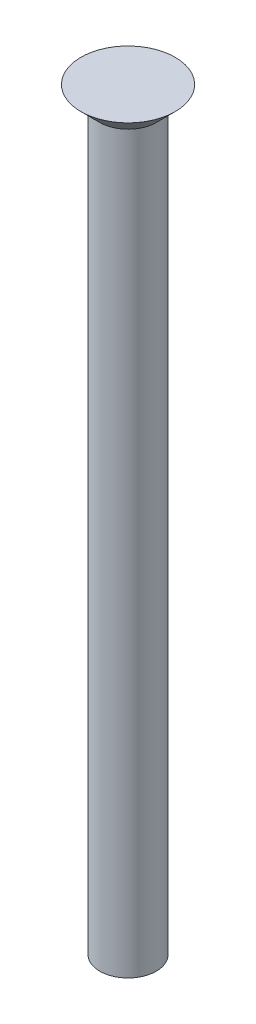
ISO-10303-21;
HEADER;
FILE_DESCRIPTION(('STEP AP214'),'2;1');
FILE_NAME('part.step','',(''),(''),'','','');
FILE_SCHEMA(('AUTOMOTIVE_DESIGN { 1 0 10303 214 1 1 1 1 }'));
ENDSEC;
DATA;
#1=APPLICATION_CONTEXT('core data for automotive mechanical design processes');
#2=APPLICATION_PROTOCOL_DEFINITION('international standard','automotive_design',2000,#1);
#3=PRODUCT_CONTEXT('',#1,'mechanical');
#4=PRODUCT('Part','Part','',(#3));
#5=PRODUCT_RELATED_PRODUCT_CATEGORY('part','',(#4));
#6=PRODUCT_DEFINITION_FORMATION('','',#4);
#7=PRODUCT_DEFINITION_CONTEXT('part definition',#1,'design');
#8=PRODUCT_DEFINITION('design','',#6,#7);
#9=PRODUCT_DEFINITION_SHAPE('','',#8);
#10=(LENGTH_UNIT() NAMED_UNIT(*) SI_UNIT(.MILLI.,.METRE.));
#11=(NAMED_UNIT(*) PLANE_ANGLE_UNIT() SI_UNIT($,.RADIAN.));
#12=(NAMED_UNIT(*) SI_UNIT($,.STERADIAN.) SOLID_ANGLE_UNIT());
#13=UNCERTAINTY_MEASURE_WITH_UNIT(LENGTH_MEASURE(1.E-05),#10,'distance_accuracy_value','');
#14=(GEOMETRIC_REPRESENTATION_CONTEXT(3) GLOBAL_UNCERTAINTY_ASSIGNED_CONTEXT((#13)) GLOBAL_UNIT_ASSIGNED_CONTEXT((#10,
#11,#12)) REPRESENTATION_CONTEXT('',''));
#15=CARTESIAN_POINT('',(0.,0.,0.));
#16=DIRECTION('',(0.,0.,1.));
#17=DIRECTION('',(1.,0.,0.));
#18=AXIS2_PLACEMENT_3D('',#15,#16,#17);
#19=CARTESIAN_POINT('',(0.,40.,0.));
#20=DIRECTION('',(0.,-1.,0.));
#21=DIRECTION('',(0.,0.,-1.));
#22=AXIS2_PLACEMENT_3D('',#19,#20,#21);
#23=PLANE('',#22);
#24=CARTESIAN_POINT('',(0.,40.,0.));
#25=DIRECTION('',(0.,-1.,0.));
#26=DIRECTION('',(0.,0.,-1.));
#27=AXIS2_PLACEMENT_3D('',#24,#25,#26);
#28=CIRCLE('',#27,2.5);
#29=CARTESIAN_POINT('',(0.,40.,-2.5));
#30=VERTEX_POINT('',#29);
#31=EDGE_CURVE('E10',#30,#30,#28,.T.);
#32=ORIENTED_EDGE('',*,*,#31,.F.);
#33=EDGE_LOOP('',(#32));
#34=FACE_BOUND('',#33,.T.);
#35=ADVANCED_FACE('F30',(#34),#23,.F.);
#36=CARTESIAN_POINT('',(0.,40.,0.));
#37=DIRECTION('',(0.,1.,0.));
#38=DIRECTION('',(0.,0.,1.));
#39=AXIS2_PLACEMENT_3D('',#36,#37,#38);
#40=CONICAL_SURFACE('',#39,2.5,0.785398163397452);
#41=CARTESIAN_POINT('',(0.,39.,0.));
#42=DIRECTION('',(0.,-1.,0.));
#43=DIRECTION('',(0.,0.,-1.));
#44=AXIS2_PLACEMENT_3D('',#41,#42,#43);
#45=CIRCLE('',#44,1.50000000000001);
#46=CARTESIAN_POINT('',(0.,39.,-1.50000000000001));
#47=VERTEX_POINT('',#46);
#48=EDGE_CURVE('E36',#47,#47,#45,.T.);
#49=ORIENTED_EDGE('',*,*,#48,.F.);
#50=EDGE_LOOP('',(#49));
#51=FACE_BOUND('',#50,.T.);
#52=ORIENTED_EDGE('',*,*,#31,.T.);
#53=EDGE_LOOP('',(#52));
#54=FACE_BOUND('',#53,.T.);
#55=ADVANCED_FACE('F51',(#51,#54),#40,.T.);
#56=CARTESIAN_POINT('',(0.,0.,0.));
#57=DIRECTION('',(0.,-1.,0.));
#58=DIRECTION('',(0.,0.,-1.));
#59=AXIS2_PLACEMENT_3D('',#56,#57,#58);
#60=CYLINDRICAL_SURFACE('',#59,1.5);
#61=CARTESIAN_POINT('',(0.,0.,0.));
#62=DIRECTION('',(0.,-1.,0.));
#63=DIRECTION('',(0.,0.,-1.));
#64=AXIS2_PLACEMENT_3D('',#61,#62,#63);
#65=CIRCLE('',#64,1.5);
#66=CARTESIAN_POINT('',(0.,0.,-1.5));
#67=VERTEX_POINT('',#66);
#68=EDGE_CURVE('E40',#67,#67,#65,.T.);
#69=ORIENTED_EDGE('',*,*,#68,.F.);
#70=EDGE_LOOP('',(#69));
#71=FACE_BOUND('',#70,.T.);
#72=ORIENTED_EDGE('',*,*,#48,.T.);
#73=EDGE_LOOP('',(#72));
#74=FACE_BOUND('',#73,.T.);
#75=ADVANCED_FACE('F49',(#71,#74),#60,.T.);
#76=CARTESIAN_POINT('',(-1.5,0.,0.));
#77=DIRECTION('',(0.,1.,0.));
#78=DIRECTION('',(0.,0.,1.));
#79=AXIS2_PLACEMENT_3D('',#76,#77,#78);
#80=PLANE('',#79);
#81=ORIENTED_EDGE('',*,*,#68,.T.);
#82=EDGE_LOOP('',(#81));
#83=FACE_BOUND('',#82,.T.);
#84=ADVANCED_FACE('F47',(#83),#80,.F.);
#85=CLOSED_SHELL('',(#35,#55,#75,#84));
#86=MANIFOLD_SOLID_BREP('B2',#85);
#87=ADVANCED_BREP_SHAPE_REPRESENTATION('',(#18,#86),#14);
#88=SHAPE_DEFINITION_REPRESENTATION(#9,#87);
ENDSEC;
END-ISO-10303-21;
